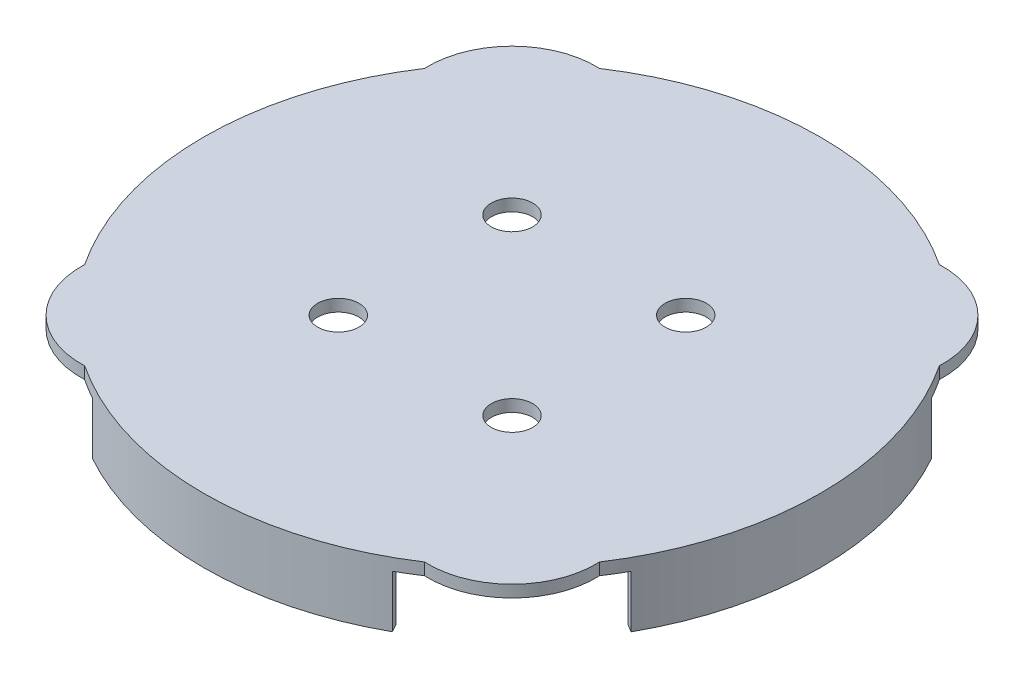
ISO-10303-21;
HEADER;
FILE_DESCRIPTION(('STEP AP214'),'2;1');
FILE_NAME('part.step','',(''),(''),'','','');
FILE_SCHEMA(('AUTOMOTIVE_DESIGN { 1 0 10303 214 1 1 1 1 }'));
ENDSEC;
DATA;
#1=APPLICATION_CONTEXT('core data for automotive mechanical design processes');
#2=APPLICATION_PROTOCOL_DEFINITION('international standard','automotive_design',2000,#1);
#3=PRODUCT_CONTEXT('',#1,'mechanical');
#4=PRODUCT('Part','Part','',(#3));
#5=PRODUCT_RELATED_PRODUCT_CATEGORY('part','',(#4));
#6=PRODUCT_DEFINITION_FORMATION('','',#4);
#7=PRODUCT_DEFINITION_CONTEXT('part definition',#1,'design');
#8=PRODUCT_DEFINITION('design','',#6,#7);
#9=PRODUCT_DEFINITION_SHAPE('','',#8);
#10=(LENGTH_UNIT() NAMED_UNIT(*) SI_UNIT(.MILLI.,.METRE.));
#11=(NAMED_UNIT(*) PLANE_ANGLE_UNIT() SI_UNIT($,.RADIAN.));
#12=(NAMED_UNIT(*) SI_UNIT($,.STERADIAN.) SOLID_ANGLE_UNIT());
#13=UNCERTAINTY_MEASURE_WITH_UNIT(LENGTH_MEASURE(1.E-05),#10,'distance_accuracy_value','');
#14=(GEOMETRIC_REPRESENTATION_CONTEXT(3) GLOBAL_UNCERTAINTY_ASSIGNED_CONTEXT((#13)) GLOBAL_UNIT_ASSIGNED_CONTEXT((#10,
#11,#12)) REPRESENTATION_CONTEXT('',''));
#15=CARTESIAN_POINT('',(0.,0.,0.));
#16=DIRECTION('',(0.,0.,1.));
#17=DIRECTION('',(1.,0.,0.));
#18=AXIS2_PLACEMENT_3D('',#15,#16,#17);
#19=CARTESIAN_POINT('',(14.5,0.,-14.5));
#20=DIRECTION('',(0.,1.,0.));
#21=DIRECTION('',(0.,0.,1.));
#22=AXIS2_PLACEMENT_3D('',#19,#20,#21);
#23=PLANE('',#22);
#24=CARTESIAN_POINT('',(14.5,0.,-14.5));
#25=DIRECTION('',(0.,1.,0.));
#26=DIRECTION('',(0.,0.,1.));
#27=AXIS2_PLACEMENT_3D('',#24,#25,#26);
#28=CIRCLE('',#27,3.45);
#29=CARTESIAN_POINT('',(14.5,0.,-11.05));
#30=VERTEX_POINT('',#29);
#31=EDGE_CURVE('E369',#30,#30,#28,.T.);
#32=ORIENTED_EDGE('',*,*,#31,.T.);
#33=EDGE_LOOP('',(#32));
#34=FACE_BOUND('',#33,.T.);
#35=CARTESIAN_POINT('',(-14.5,0.,-14.4999999999998));
#36=DIRECTION('',(0.,1.,0.));
#37=DIRECTION('',(0.,0.,1.));
#38=AXIS2_PLACEMENT_3D('',#35,#36,#37);
#39=CIRCLE('',#38,3.45);
#40=CARTESIAN_POINT('',(-14.5,0.,-11.0499999999998));
#41=VERTEX_POINT('',#40);
#42=EDGE_CURVE('E361',#41,#41,#39,.T.);
#43=ORIENTED_EDGE('',*,*,#42,.T.);
#44=EDGE_LOOP('',(#43));
#45=FACE_BOUND('',#44,.T.);
#46=CARTESIAN_POINT('',(-14.4999999999997,0.,14.5000000000002));
#47=DIRECTION('',(0.,1.,0.));
#48=DIRECTION('',(0.,0.,1.));
#49=AXIS2_PLACEMENT_3D('',#46,#47,#48);
#50=CIRCLE('',#49,3.45);
#51=CARTESIAN_POINT('',(-14.4999999999997,0.,17.9500000000002));
#52=VERTEX_POINT('',#51);
#53=EDGE_CURVE('E353',#52,#52,#50,.T.);
#54=ORIENTED_EDGE('',*,*,#53,.T.);
#55=EDGE_LOOP('',(#54));
#56=FACE_BOUND('',#55,.T.);
#57=CARTESIAN_POINT('',(14.5000000000003,0.,14.5));
#58=DIRECTION('',(0.,1.,0.));
#59=DIRECTION('',(0.,0.,1.));
#60=AXIS2_PLACEMENT_3D('',#57,#58,#59);
#61=CIRCLE('',#60,3.45);
#62=CARTESIAN_POINT('',(14.5000000000003,0.,17.95));
#63=VERTEX_POINT('',#62);
#64=EDGE_CURVE('E348',#63,#63,#61,.T.);
#65=ORIENTED_EDGE('',*,*,#64,.T.);
#66=EDGE_LOOP('',(#65));
#67=FACE_BOUND('',#66,.T.);
#68=DIRECTION('',(0.486274592443671,0.,0.873806054421541));
#69=VECTOR('',#68,1.);
#70=CARTESIAN_POINT('',(24.3137296222045,0.,43.6903027210654));
#71=LINE('',#70,#69);
#72=CARTESIAN_POINT('',(24.3137296222045,0.,43.6903027210654));
#73=VERTEX_POINT('',#72);
#74=CARTESIAN_POINT('',(25.04314151087,0.,45.0010118026977));
#75=VERTEX_POINT('',#74);
#76=EDGE_CURVE('E548',#73,#75,#71,.T.);
#77=ORIENTED_EDGE('',*,*,#76,.F.);
#78=CARTESIAN_POINT('',(0.,0.,-6.03683769639929E-13));
#79=DIRECTION('',(0.,1.,0.));
#80=DIRECTION('',(1.,0.,0.));
#81=AXIS2_PLACEMENT_3D('',#78,#79,#80);
#82=CIRCLE('',#81,50.0000000000008);
#83=CARTESIAN_POINT('',(-24.3137296222674,0.,43.690302721031));
#84=VERTEX_POINT('',#83);
#85=EDGE_CURVE('E226',#84,#73,#82,.T.);
#86=ORIENTED_EDGE('',*,*,#85,.F.);
#87=DIRECTION('',(0.519693841497621,0.,-0.85435256838699));
#88=VECTOR('',#87,1.);
#89=CARTESIAN_POINT('',(-25.0938366318168,0.,44.9727624579111));
#90=LINE('',#89,#88);
#91=CARTESIAN_POINT('',(-25.0938366318168,0.,44.9727624579111));
#92=VERTEX_POINT('',#91);
#93=EDGE_CURVE('E222',#92,#84,#90,.T.);
#94=ORIENTED_EDGE('',*,*,#93,.F.);
#95=CARTESIAN_POINT('',(0.,0.,0.));
#96=DIRECTION('',(0.,1.,0.));
#97=DIRECTION('',(0.,0.,1.));
#98=AXIS2_PLACEMENT_3D('',#95,#96,#97);
#99=CIRCLE('',#98,51.5);
#100=CARTESIAN_POINT('',(-28.363609444048,0.,42.9855284869863));
#101=VERTEX_POINT('',#100);
#102=EDGE_CURVE('E432',#101,#92,#99,.T.);
#103=ORIENTED_EDGE('',*,*,#102,.F.);
#104=CARTESIAN_POINT('',(-29.,0.,29.0000000000004));
#105=DIRECTION('',(0.,1.,0.));
#106=DIRECTION('',(0.,0.,1.));
#107=AXIS2_PLACEMENT_3D('',#104,#105,#106);
#108=CIRCLE('',#107,14.);
#109=CARTESIAN_POINT('',(-42.9855284869859,0.,28.3636094440485));
#110=VERTEX_POINT('',#109);
#111=EDGE_CURVE('E428',#110,#101,#108,.T.);
#112=ORIENTED_EDGE('',*,*,#111,.F.);
#113=CARTESIAN_POINT('',(0.,0.,0.));
#114=DIRECTION('',(0.,1.,0.));
#115=DIRECTION('',(0.,0.,1.));
#116=AXIS2_PLACEMENT_3D('',#113,#114,#115);
#117=CIRCLE('',#116,51.5);
#118=CARTESIAN_POINT('',(-45.001011802698,0.,25.0431415108695));
#119=VERTEX_POINT('',#118);
#120=EDGE_CURVE('E423',#119,#110,#117,.T.);
#121=ORIENTED_EDGE('',*,*,#120,.F.);
#122=DIRECTION('',(-0.873806054421546,0.,0.486274592443662));
#123=VECTOR('',#122,1.);
#124=CARTESIAN_POINT('',(-43.6903027210657,0.,24.313729622204));
#125=LINE('',#124,#123);
#126=CARTESIAN_POINT('',(-43.6903027210657,0.,24.313729622204));
#127=VERTEX_POINT('',#126);
#128=EDGE_CURVE('E234',#127,#119,#125,.T.);
#129=ORIENTED_EDGE('',*,*,#128,.F.);
#130=CARTESIAN_POINT('',(6.03683769639929E-13,0.,0.));
#131=DIRECTION('',(0.,1.,0.));
#132=DIRECTION('',(0.,0.,1.));
#133=AXIS2_PLACEMENT_3D('',#130,#131,#132);
#134=CIRCLE('',#133,50.0000000000008);
#135=CARTESIAN_POINT('',(-43.6903027210307,0.,-24.3137296222678));
#136=VERTEX_POINT('',#135);
#137=EDGE_CURVE('E229',#136,#127,#134,.T.);
#138=ORIENTED_EDGE('',*,*,#137,.F.);
#139=DIRECTION('',(0.854352568386984,0.,0.51969384149763));
#140=VECTOR('',#139,1.);
#141=CARTESIAN_POINT('',(-44.9727624579108,0.,-25.0938366318172));
#142=LINE('',#141,#140);
#143=CARTESIAN_POINT('',(-44.9727624579108,0.,-25.0938366318172));
#144=VERTEX_POINT('',#143);
#145=EDGE_CURVE('E245',#144,#136,#142,.T.);
#146=ORIENTED_EDGE('',*,*,#145,.F.);
#147=CARTESIAN_POINT('',(-42.9855284869861,0.,-28.3636094440484));
#148=VERTEX_POINT('',#147);
#149=EDGE_CURVE('E424',#148,#144,#117,.T.);
#150=ORIENTED_EDGE('',*,*,#149,.F.);
#151=CARTESIAN_POINT('',(-29.0000000000001,0.,-29.));
#152=DIRECTION('',(0.,1.,0.));
#153=DIRECTION('',(0.,0.,1.));
#154=AXIS2_PLACEMENT_3D('',#151,#152,#153);
#155=CIRCLE('',#154,14.);
#156=CARTESIAN_POINT('',(-28.3636094440485,0.,-42.985528486986));
#157=VERTEX_POINT('',#156);
#158=EDGE_CURVE('E420',#157,#148,#155,.T.);
#159=ORIENTED_EDGE('',*,*,#158,.F.);
#160=CARTESIAN_POINT('',(0.,0.,0.));
#161=DIRECTION('',(0.,1.,0.));
#162=DIRECTION('',(0.,0.,1.));
#163=AXIS2_PLACEMENT_3D('',#160,#161,#162);
#164=CIRCLE('',#163,51.5);
#165=CARTESIAN_POINT('',(-25.0431415108697,0.,-45.0010118026979));
#166=VERTEX_POINT('',#165);
#167=EDGE_CURVE('E415',#166,#157,#164,.T.);
#168=ORIENTED_EDGE('',*,*,#167,.F.);
#169=DIRECTION('',(-0.486274592443665,0.,-0.873806054421545));
#170=VECTOR('',#169,1.);
#171=CARTESIAN_POINT('',(-24.3137296222042,0.,-43.6903027210656));
#172=LINE('',#171,#170);
#173=CARTESIAN_POINT('',(-24.3137296222042,0.,-43.6903027210656));
#174=VERTEX_POINT('',#173);
#175=EDGE_CURVE('E289',#174,#166,#172,.T.);
#176=ORIENTED_EDGE('',*,*,#175,.F.);
#177=CARTESIAN_POINT('',(0.,0.,6.03683769639929E-13));
#178=DIRECTION('',(0.,1.,0.));
#179=DIRECTION('',(-1.,0.,0.));
#180=AXIS2_PLACEMENT_3D('',#177,#178,#179);
#181=CIRCLE('',#180,50.0000000000008);
#182=CARTESIAN_POINT('',(24.3137296222677,0.,-43.6903027210308));
#183=VERTEX_POINT('',#182);
#184=EDGE_CURVE('E270',#183,#174,#181,.T.);
#185=ORIENTED_EDGE('',*,*,#184,.F.);
#186=DIRECTION('',(-0.519693841497627,0.,0.854352568386986));
#187=VECTOR('',#186,1.);
#188=CARTESIAN_POINT('',(25.0938366318171,0.,-44.9727624579109));
#189=LINE('',#188,#187);
#190=CARTESIAN_POINT('',(25.0938366318171,0.,-44.9727624579109));
#191=VERTEX_POINT('',#190);
#192=EDGE_CURVE('E276',#191,#183,#189,.T.);
#193=ORIENTED_EDGE('',*,*,#192,.F.);
#194=CARTESIAN_POINT('',(28.3636094440485,0.,-42.985528486986));
#195=VERTEX_POINT('',#194);
#196=EDGE_CURVE('E416',#195,#191,#164,.T.);
#197=ORIENTED_EDGE('',*,*,#196,.F.);
#198=CARTESIAN_POINT('',(28.9999999999999,0.,-29.));
#199=DIRECTION('',(0.,1.,0.));
#200=DIRECTION('',(0.,0.,1.));
#201=AXIS2_PLACEMENT_3D('',#198,#199,#200);
#202=CIRCLE('',#201,14.);
#203=CARTESIAN_POINT('',(42.9855284869859,0.,-28.3636094440486));
#204=VERTEX_POINT('',#203);
#205=EDGE_CURVE('E412',#204,#195,#202,.T.);
#206=ORIENTED_EDGE('',*,*,#205,.F.);
#207=CARTESIAN_POINT('',(0.,0.,0.));
#208=DIRECTION('',(0.,1.,0.));
#209=DIRECTION('',(0.,0.,1.));
#210=AXIS2_PLACEMENT_3D('',#207,#208,#209);
#211=CIRCLE('',#210,51.5);
#212=CARTESIAN_POINT('',(45.001011802698,0.,-25.0431415108695));
#213=VERTEX_POINT('',#212);
#214=EDGE_CURVE('E377',#213,#204,#211,.T.);
#215=ORIENTED_EDGE('',*,*,#214,.F.);
#216=DIRECTION('',(0.873806054421546,0.,-0.486274592443662));
#217=VECTOR('',#216,1.);
#218=CARTESIAN_POINT('',(43.6903027210657,0.,-24.313729622204));
#219=LINE('',#218,#217);
#220=CARTESIAN_POINT('',(43.6903027210657,0.,-24.313729622204));
#221=VERTEX_POINT('',#220);
#222=EDGE_CURVE('E326',#221,#213,#219,.T.);
#223=ORIENTED_EDGE('',*,*,#222,.F.);
#224=CARTESIAN_POINT('',(-6.03683769639929E-13,0.,0.));
#225=DIRECTION('',(0.,1.,0.));
#226=DIRECTION('',(0.,0.,-1.));
#227=AXIS2_PLACEMENT_3D('',#224,#225,#226);
#228=CIRCLE('',#227,50.0000000000008);
#229=CARTESIAN_POINT('',(43.6903027210307,0.,24.3137296222678));
#230=VERTEX_POINT('',#229);
#231=EDGE_CURVE('E307',#230,#221,#228,.T.);
#232=ORIENTED_EDGE('',*,*,#231,.F.);
#233=DIRECTION('',(-0.854352568386984,0.,-0.51969384149763));
#234=VECTOR('',#233,1.);
#235=CARTESIAN_POINT('',(44.9727624579108,0.,25.0938366318172));
#236=LINE('',#235,#234);
#237=CARTESIAN_POINT('',(44.9727624579108,0.,25.0938366318172));
#238=VERTEX_POINT('',#237);
#239=EDGE_CURVE('E313',#238,#230,#236,.T.);
#240=ORIENTED_EDGE('',*,*,#239,.F.);
#241=CARTESIAN_POINT('',(42.9855284869862,0.,28.3636094440484));
#242=VERTEX_POINT('',#241);
#243=EDGE_CURVE('E408',#242,#238,#211,.T.);
#244=ORIENTED_EDGE('',*,*,#243,.F.);
#245=CARTESIAN_POINT('',(29.,0.,28.9999999999996));
#246=DIRECTION('',(0.,1.,0.));
#247=DIRECTION('',(0.,0.,1.));
#248=AXIS2_PLACEMENT_3D('',#245,#246,#247);
#249=CIRCLE('',#248,14.0000000000002);
#250=CARTESIAN_POINT('',(28.3636094440486,0.,42.9855284869858));
#251=VERTEX_POINT('',#250);
#252=EDGE_CURVE('E386',#251,#242,#249,.T.);
#253=ORIENTED_EDGE('',*,*,#252,.F.);
#254=EDGE_CURVE('E431',#75,#251,#99,.T.);
#255=ORIENTED_EDGE('',*,*,#254,.F.);
#256=EDGE_LOOP('',(#77,#86,#94,#103,#112,#121,#129,#138,#146,#150,#159,#168,#176,#185,#193,#197,
#206,#215,#223,#232,#240,#244,#253,#255));
#257=FACE_BOUND('',#256,.T.);
#258=ADVANCED_FACE('F41',(#34,#45,#56,#67,#257),#23,.F.);
#259=CARTESIAN_POINT('',(14.5,2.,-14.5));
#260=DIRECTION('',(0.,1.,0.));
#261=DIRECTION('',(0.,0.,1.));
#262=AXIS2_PLACEMENT_3D('',#259,#260,#261);
#263=PLANE('',#262);
#264=CARTESIAN_POINT('',(-14.4999999999997,2.,14.5000000000002));
#265=DIRECTION('',(0.,1.,0.));
#266=DIRECTION('',(0.,0.,1.));
#267=AXIS2_PLACEMENT_3D('',#264,#265,#266);
#268=CIRCLE('',#267,3.45);
#269=CARTESIAN_POINT('',(-14.4999999999997,2.,17.9500000000002));
#270=VERTEX_POINT('',#269);
#271=EDGE_CURVE('E357',#270,#270,#268,.T.);
#272=ORIENTED_EDGE('',*,*,#271,.F.);
#273=EDGE_LOOP('',(#272));
#274=FACE_BOUND('',#273,.T.);
#275=CARTESIAN_POINT('',(14.5,2.,-14.5));
#276=DIRECTION('',(0.,1.,0.));
#277=DIRECTION('',(0.,0.,1.));
#278=AXIS2_PLACEMENT_3D('',#275,#276,#277);
#279=CIRCLE('',#278,3.45);
#280=CARTESIAN_POINT('',(14.5,2.,-11.05));
#281=VERTEX_POINT('',#280);
#282=EDGE_CURVE('E373',#281,#281,#279,.T.);
#283=ORIENTED_EDGE('',*,*,#282,.F.);
#284=EDGE_LOOP('',(#283));
#285=FACE_BOUND('',#284,.T.);
#286=CARTESIAN_POINT('',(0.,2.,0.));
#287=DIRECTION('',(0.,1.,0.));
#288=DIRECTION('',(0.,0.,1.));
#289=AXIS2_PLACEMENT_3D('',#286,#287,#288);
#290=CIRCLE('',#289,51.5);
#291=CARTESIAN_POINT('',(42.9855284869862,2.,28.3636094440484));
#292=VERTEX_POINT('',#291);
#293=CARTESIAN_POINT('',(42.9855284869859,2.,-28.3636094440486));
#294=VERTEX_POINT('',#293);
#295=EDGE_CURVE('E381',#292,#294,#290,.T.);
#296=ORIENTED_EDGE('',*,*,#295,.T.);
#297=CARTESIAN_POINT('',(28.9999999999999,2.,-29.));
#298=DIRECTION('',(0.,1.,0.));
#299=DIRECTION('',(0.,0.,1.));
#300=AXIS2_PLACEMENT_3D('',#297,#298,#299);
#301=CIRCLE('',#300,14.);
#302=CARTESIAN_POINT('',(28.3636094440485,2.,-42.985528486986));
#303=VERTEX_POINT('',#302);
#304=EDGE_CURVE('E385',#294,#303,#301,.T.);
#305=ORIENTED_EDGE('',*,*,#304,.T.);
#306=CARTESIAN_POINT('',(0.,2.,0.));
#307=DIRECTION('',(0.,1.,0.));
#308=DIRECTION('',(0.,0.,1.));
#309=AXIS2_PLACEMENT_3D('',#306,#307,#308);
#310=CIRCLE('',#309,51.5);
#311=CARTESIAN_POINT('',(-28.3636094440485,2.,-42.985528486986));
#312=VERTEX_POINT('',#311);
#313=EDGE_CURVE('E389',#303,#312,#310,.T.);
#314=ORIENTED_EDGE('',*,*,#313,.T.);
#315=CARTESIAN_POINT('',(-29.0000000000001,2.,-29.));
#316=DIRECTION('',(0.,1.,0.));
#317=DIRECTION('',(0.,0.,1.));
#318=AXIS2_PLACEMENT_3D('',#315,#316,#317);
#319=CIRCLE('',#318,14.);
#320=CARTESIAN_POINT('',(-42.9855284869861,2.,-28.3636094440484));
#321=VERTEX_POINT('',#320);
#322=EDGE_CURVE('E392',#312,#321,#319,.T.);
#323=ORIENTED_EDGE('',*,*,#322,.T.);
#324=CARTESIAN_POINT('',(0.,2.,0.));
#325=DIRECTION('',(0.,1.,0.));
#326=DIRECTION('',(0.,0.,1.));
#327=AXIS2_PLACEMENT_3D('',#324,#325,#326);
#328=CIRCLE('',#327,51.5);
#329=CARTESIAN_POINT('',(-42.9855284869859,2.,28.3636094440485));
#330=VERTEX_POINT('',#329);
#331=EDGE_CURVE('E395',#321,#330,#328,.T.);
#332=ORIENTED_EDGE('',*,*,#331,.T.);
#333=CARTESIAN_POINT('',(-29.,2.,29.0000000000004));
#334=DIRECTION('',(0.,1.,0.));
#335=DIRECTION('',(0.,0.,1.));
#336=AXIS2_PLACEMENT_3D('',#333,#334,#335);
#337=CIRCLE('',#336,14.);
#338=CARTESIAN_POINT('',(-28.363609444048,2.,42.9855284869863));
#339=VERTEX_POINT('',#338);
#340=EDGE_CURVE('E398',#330,#339,#337,.T.);
#341=ORIENTED_EDGE('',*,*,#340,.T.);
#342=CARTESIAN_POINT('',(0.,2.,0.));
#343=DIRECTION('',(0.,1.,0.));
#344=DIRECTION('',(0.,0.,1.));
#345=AXIS2_PLACEMENT_3D('',#342,#343,#344);
#346=CIRCLE('',#345,51.5);
#347=CARTESIAN_POINT('',(28.3636094440486,2.,42.9855284869858));
#348=VERTEX_POINT('',#347);
#349=EDGE_CURVE('E401',#339,#348,#346,.T.);
#350=ORIENTED_EDGE('',*,*,#349,.T.);
#351=CARTESIAN_POINT('',(29.,2.,28.9999999999996));
#352=DIRECTION('',(0.,1.,0.));
#353=DIRECTION('',(0.,0.,1.));
#354=AXIS2_PLACEMENT_3D('',#351,#352,#353);
#355=CIRCLE('',#354,14.0000000000002);
#356=EDGE_CURVE('E404',#348,#292,#355,.T.);
#357=ORIENTED_EDGE('',*,*,#356,.T.);
#358=EDGE_LOOP('',(#296,#305,#314,#323,#332,#341,#350,#357));
#359=FACE_BOUND('',#358,.T.);
#360=CARTESIAN_POINT('',(-14.5,2.,-14.4999999999998));
#361=DIRECTION('',(0.,1.,0.));
#362=DIRECTION('',(0.,0.,1.));
#363=AXIS2_PLACEMENT_3D('',#360,#361,#362);
#364=CIRCLE('',#363,3.45);
#365=CARTESIAN_POINT('',(-14.5,2.,-11.0499999999998));
#366=VERTEX_POINT('',#365);
#367=EDGE_CURVE('E365',#366,#366,#364,.T.);
#368=ORIENTED_EDGE('',*,*,#367,.F.);
#369=EDGE_LOOP('',(#368));
#370=FACE_BOUND('',#369,.T.);
#371=CARTESIAN_POINT('',(14.5000000000003,2.,14.5));
#372=DIRECTION('',(0.,1.,0.));
#373=DIRECTION('',(0.,0.,1.));
#374=AXIS2_PLACEMENT_3D('',#371,#372,#373);
#375=CIRCLE('',#374,3.45);
#376=CARTESIAN_POINT('',(14.5000000000003,2.,17.95));
#377=VERTEX_POINT('',#376);
#378=EDGE_CURVE('E349',#377,#377,#375,.T.);
#379=ORIENTED_EDGE('',*,*,#378,.F.);
#380=EDGE_LOOP('',(#379));
#381=FACE_BOUND('',#380,.T.);
#382=ADVANCED_FACE('F561',(#274,#285,#359,#370,#381),#263,.T.);
#383=CARTESIAN_POINT('',(0.,2.,0.));
#384=DIRECTION('',(0.,-1.,0.));
#385=DIRECTION('',(0.,0.,-1.));
#386=AXIS2_PLACEMENT_3D('',#383,#384,#385);
#387=CYLINDRICAL_SURFACE('',#386,51.5);
#388=ORIENTED_EDGE('',*,*,#243,.T.);
#389=DIRECTION('',(0.,1.,0.));
#390=VECTOR('',#389,1.);
#391=CARTESIAN_POINT('',(44.9727624579108,-8.75,25.0938366318172));
#392=LINE('',#391,#390);
#393=CARTESIAN_POINT('',(44.9727624579108,-8.75,25.0938366318172));
#394=VERTEX_POINT('',#393);
#395=EDGE_CURVE('E336',#394,#238,#392,.T.);
#396=ORIENTED_EDGE('',*,*,#395,.F.);
#397=CARTESIAN_POINT('',(-6.03683769639929E-13,-8.75,0.));
#398=DIRECTION('',(0.,-1.,0.));
#399=DIRECTION('',(0.,0.,-1.));
#400=AXIS2_PLACEMENT_3D('',#397,#398,#399);
#401=CIRCLE('',#400,51.5000000000006);
#402=CARTESIAN_POINT('',(45.001011802698,-8.75,-25.0431415108695));
#403=VERTEX_POINT('',#402);
#404=EDGE_CURVE('E316',#403,#394,#401,.T.);
#405=ORIENTED_EDGE('',*,*,#404,.F.);
#406=DIRECTION('',(0.,1.,0.));
#407=VECTOR('',#406,1.);
#408=CARTESIAN_POINT('',(45.001011802698,-8.75,-25.0431415108695));
#409=LINE('',#408,#407);
#410=EDGE_CURVE('E340',#403,#213,#409,.T.);
#411=ORIENTED_EDGE('',*,*,#410,.T.);
#412=ORIENTED_EDGE('',*,*,#214,.T.);
#413=DIRECTION('',(0.,-1.,0.));
#414=VECTOR('',#413,1.);
#415=CARTESIAN_POINT('',(42.9855284869859,2.,-28.3636094440486));
#416=LINE('',#415,#414);
#417=EDGE_CURVE('E11',#294,#204,#416,.T.);
#418=ORIENTED_EDGE('',*,*,#417,.F.);
#419=ORIENTED_EDGE('',*,*,#295,.F.);
#420=DIRECTION('',(0.,-1.,0.));
#421=VECTOR('',#420,1.);
#422=CARTESIAN_POINT('',(42.9855284869862,2.,28.3636094440484));
#423=LINE('',#422,#421);
#424=EDGE_CURVE('E407',#292,#242,#423,.T.);
#425=ORIENTED_EDGE('',*,*,#424,.T.);
#426=EDGE_LOOP('',(#388,#396,#405,#411,#412,#418,#419,#425));
#427=FACE_BOUND('',#426,.T.);
#428=ADVANCED_FACE('F43',(#427),#387,.T.);
#429=CARTESIAN_POINT('',(28.9999999999999,2.,-29.));
#430=DIRECTION('',(0.,-1.,0.));
#431=DIRECTION('',(0.,0.,-1.));
#432=AXIS2_PLACEMENT_3D('',#429,#430,#431);
#433=CYLINDRICAL_SURFACE('',#432,14.);
#434=ORIENTED_EDGE('',*,*,#205,.T.);
#435=DIRECTION('',(0.,-1.,0.));
#436=VECTOR('',#435,1.);
#437=CARTESIAN_POINT('',(28.3636094440485,2.,-42.985528486986));
#438=LINE('',#437,#436);
#439=EDGE_CURVE('E50',#303,#195,#438,.T.);
#440=ORIENTED_EDGE('',*,*,#439,.F.);
#441=ORIENTED_EDGE('',*,*,#304,.F.);
#442=ORIENTED_EDGE('',*,*,#417,.T.);
#443=EDGE_LOOP('',(#434,#440,#441,#442));
#444=FACE_BOUND('',#443,.T.);
#445=ADVANCED_FACE('F586',(#444),#433,.T.);
#446=CARTESIAN_POINT('',(0.,2.,0.));
#447=DIRECTION('',(0.,-1.,0.));
#448=DIRECTION('',(0.,0.,-1.));
#449=AXIS2_PLACEMENT_3D('',#446,#447,#448);
#450=CYLINDRICAL_SURFACE('',#449,51.5);
#451=ORIENTED_EDGE('',*,*,#196,.T.);
#452=DIRECTION('',(0.,1.,0.));
#453=VECTOR('',#452,1.);
#454=CARTESIAN_POINT('',(25.0938366318171,-8.75,-44.9727624579109));
#455=LINE('',#454,#453);
#456=CARTESIAN_POINT('',(25.0938366318171,-8.75,-44.9727624579109));
#457=VERTEX_POINT('',#456);
#458=EDGE_CURVE('E298',#457,#191,#455,.T.);
#459=ORIENTED_EDGE('',*,*,#458,.F.);
#460=CARTESIAN_POINT('',(0.,-8.75,6.03683769639929E-13));
#461=DIRECTION('',(0.,-1.,0.));
#462=DIRECTION('',(-1.,0.,0.));
#463=AXIS2_PLACEMENT_3D('',#460,#461,#462);
#464=CIRCLE('',#463,51.5000000000006);
#465=CARTESIAN_POINT('',(-25.0431415108697,-8.75,-45.0010118026979));
#466=VERTEX_POINT('',#465);
#467=EDGE_CURVE('E279',#466,#457,#464,.T.);
#468=ORIENTED_EDGE('',*,*,#467,.F.);
#469=DIRECTION('',(0.,1.,0.));
#470=VECTOR('',#469,1.);
#471=CARTESIAN_POINT('',(-25.0431415108697,-8.75,-45.0010118026979));
#472=LINE('',#471,#470);
#473=EDGE_CURVE('E301',#466,#166,#472,.T.);
#474=ORIENTED_EDGE('',*,*,#473,.T.);
#475=ORIENTED_EDGE('',*,*,#167,.T.);
#476=DIRECTION('',(0.,-1.,0.));
#477=VECTOR('',#476,1.);
#478=CARTESIAN_POINT('',(-28.3636094440485,2.,-42.985528486986));
#479=LINE('',#478,#477);
#480=EDGE_CURVE('E457',#312,#157,#479,.T.);
#481=ORIENTED_EDGE('',*,*,#480,.F.);
#482=ORIENTED_EDGE('',*,*,#313,.F.);
#483=ORIENTED_EDGE('',*,*,#439,.T.);
#484=EDGE_LOOP('',(#451,#459,#468,#474,#475,#481,#482,#483));
#485=FACE_BOUND('',#484,.T.);
#486=ADVANCED_FACE('F466',(#485),#450,.T.);
#487=CARTESIAN_POINT('',(-29.0000000000001,2.,-29.));
#488=DIRECTION('',(0.,-1.,0.));
#489=DIRECTION('',(0.,0.,-1.));
#490=AXIS2_PLACEMENT_3D('',#487,#488,#489);
#491=CYLINDRICAL_SURFACE('',#490,14.);
#492=ORIENTED_EDGE('',*,*,#158,.T.);
#493=DIRECTION('',(0.,-1.,0.));
#494=VECTOR('',#493,1.);
#495=CARTESIAN_POINT('',(-42.9855284869861,2.,-28.3636094440484));
#496=LINE('',#495,#494);
#497=EDGE_CURVE('E453',#321,#148,#496,.T.);
#498=ORIENTED_EDGE('',*,*,#497,.F.);
#499=ORIENTED_EDGE('',*,*,#322,.F.);
#500=ORIENTED_EDGE('',*,*,#480,.T.);
#501=EDGE_LOOP('',(#492,#498,#499,#500));
#502=FACE_BOUND('',#501,.T.);
#503=ADVANCED_FACE('F581',(#502),#491,.T.);
#504=CARTESIAN_POINT('',(0.,2.,0.));
#505=DIRECTION('',(0.,-1.,0.));
#506=DIRECTION('',(0.,0.,-1.));
#507=AXIS2_PLACEMENT_3D('',#504,#505,#506);
#508=CYLINDRICAL_SURFACE('',#507,51.5);
#509=ORIENTED_EDGE('',*,*,#149,.T.);
#510=DIRECTION('',(0.,1.,0.));
#511=VECTOR('',#510,1.);
#512=CARTESIAN_POINT('',(-44.9727624579108,-8.75,-25.0938366318172));
#513=LINE('',#512,#511);
#514=CARTESIAN_POINT('',(-44.9727624579108,-8.75,-25.0938366318172));
#515=VERTEX_POINT('',#514);
#516=EDGE_CURVE('E262',#515,#144,#513,.T.);
#517=ORIENTED_EDGE('',*,*,#516,.F.);
#518=CARTESIAN_POINT('',(6.03683769639929E-13,-8.75,0.));
#519=DIRECTION('',(0.,-1.,0.));
#520=DIRECTION('',(0.,0.,1.));
#521=AXIS2_PLACEMENT_3D('',#518,#519,#520);
#522=CIRCLE('',#521,51.5000000000006);
#523=CARTESIAN_POINT('',(-45.001011802698,-8.75,25.0431415108695));
#524=VERTEX_POINT('',#523);
#525=EDGE_CURVE('E248',#524,#515,#522,.T.);
#526=ORIENTED_EDGE('',*,*,#525,.F.);
#527=DIRECTION('',(0.,1.,0.));
#528=VECTOR('',#527,1.);
#529=CARTESIAN_POINT('',(-45.001011802698,-8.75,25.0431415108695));
#530=LINE('',#529,#528);
#531=EDGE_CURVE('E65',#524,#119,#530,.T.);
#532=ORIENTED_EDGE('',*,*,#531,.T.);
#533=ORIENTED_EDGE('',*,*,#120,.T.);
#534=DIRECTION('',(0.,-1.,0.));
#535=VECTOR('',#534,1.);
#536=CARTESIAN_POINT('',(-42.9855284869859,2.,28.3636094440485));
#537=LINE('',#536,#535);
#538=EDGE_CURVE('E449',#330,#110,#537,.T.);
#539=ORIENTED_EDGE('',*,*,#538,.F.);
#540=ORIENTED_EDGE('',*,*,#331,.F.);
#541=ORIENTED_EDGE('',*,*,#497,.T.);
#542=EDGE_LOOP('',(#509,#517,#526,#532,#533,#539,#540,#541));
#543=FACE_BOUND('',#542,.T.);
#544=ADVANCED_FACE('F524',(#543),#508,.T.);
#545=CARTESIAN_POINT('',(-29.,2.,29.0000000000004));
#546=DIRECTION('',(0.,-1.,0.));
#547=DIRECTION('',(0.,0.,-1.));
#548=AXIS2_PLACEMENT_3D('',#545,#546,#547);
#549=CYLINDRICAL_SURFACE('',#548,14.);
#550=ORIENTED_EDGE('',*,*,#111,.T.);
#551=DIRECTION('',(0.,-1.,0.));
#552=VECTOR('',#551,1.);
#553=CARTESIAN_POINT('',(-28.363609444048,2.,42.9855284869863));
#554=LINE('',#553,#552);
#555=EDGE_CURVE('E445',#339,#101,#554,.T.);
#556=ORIENTED_EDGE('',*,*,#555,.F.);
#557=ORIENTED_EDGE('',*,*,#340,.F.);
#558=ORIENTED_EDGE('',*,*,#538,.T.);
#559=EDGE_LOOP('',(#550,#556,#557,#558));
#560=FACE_BOUND('',#559,.T.);
#561=ADVANCED_FACE('F530',(#560),#549,.T.);
#562=CARTESIAN_POINT('',(0.,2.,0.));
#563=DIRECTION('',(0.,-1.,0.));
#564=DIRECTION('',(0.,0.,-1.));
#565=AXIS2_PLACEMENT_3D('',#562,#563,#564);
#566=CYLINDRICAL_SURFACE('',#565,51.5);
#567=ORIENTED_EDGE('',*,*,#102,.T.);
#568=DIRECTION('',(0.,1.,0.));
#569=VECTOR('',#568,1.);
#570=CARTESIAN_POINT('',(-25.0938366318168,-8.75,44.9727624579111));
#571=LINE('',#570,#569);
#572=CARTESIAN_POINT('',(-25.0938366318168,-8.75,44.9727624579111));
#573=VERTEX_POINT('',#572);
#574=EDGE_CURVE('E236',#573,#92,#571,.T.);
#575=ORIENTED_EDGE('',*,*,#574,.F.);
#576=CARTESIAN_POINT('',(0.,-8.75,-6.03683769639929E-13));
#577=DIRECTION('',(0.,-1.,0.));
#578=DIRECTION('',(1.,0.,0.));
#579=AXIS2_PLACEMENT_3D('',#576,#577,#578);
#580=CIRCLE('',#579,51.5000000000006);
#581=CARTESIAN_POINT('',(25.04314151087,-8.75,45.0010118026978));
#582=VERTEX_POINT('',#581);
#583=EDGE_CURVE('E211',#582,#573,#580,.T.);
#584=ORIENTED_EDGE('',*,*,#583,.F.);
#585=DIRECTION('',(0.,1.,0.));
#586=VECTOR('',#585,1.);
#587=CARTESIAN_POINT('',(25.04314151087,-8.75,45.0010118026978));
#588=LINE('',#587,#586);
#589=EDGE_CURVE('E57',#582,#75,#588,.T.);
#590=ORIENTED_EDGE('',*,*,#589,.T.);
#591=ORIENTED_EDGE('',*,*,#254,.T.);
#592=DIRECTION('',(0.,-1.,0.));
#593=VECTOR('',#592,1.);
#594=CARTESIAN_POINT('',(28.3636094440486,2.,42.9855284869858));
#595=LINE('',#594,#593);
#596=EDGE_CURVE('E441',#348,#251,#595,.T.);
#597=ORIENTED_EDGE('',*,*,#596,.F.);
#598=ORIENTED_EDGE('',*,*,#349,.F.);
#599=ORIENTED_EDGE('',*,*,#555,.T.);
#600=EDGE_LOOP('',(#567,#575,#584,#590,#591,#597,#598,#599));
#601=FACE_BOUND('',#600,.T.);
#602=ADVANCED_FACE('F519',(#601),#566,.T.);
#603=CARTESIAN_POINT('',(29.,2.,28.9999999999996));
#604=DIRECTION('',(0.,-1.,0.));
#605=DIRECTION('',(0.,0.,-1.));
#606=AXIS2_PLACEMENT_3D('',#603,#604,#605);
#607=CYLINDRICAL_SURFACE('',#606,14.0000000000002);
#608=ORIENTED_EDGE('',*,*,#252,.T.);
#609=ORIENTED_EDGE('',*,*,#424,.F.);
#610=ORIENTED_EDGE('',*,*,#356,.F.);
#611=ORIENTED_EDGE('',*,*,#596,.T.);
#612=EDGE_LOOP('',(#608,#609,#610,#611));
#613=FACE_BOUND('',#612,.T.);
#614=ADVANCED_FACE('F515',(#613),#607,.T.);
#615=CARTESIAN_POINT('',(14.5,2.,-14.5));
#616=DIRECTION('',(0.,-1.,0.));
#617=DIRECTION('',(0.,0.,-1.));
#618=AXIS2_PLACEMENT_3D('',#615,#616,#617);
#619=CYLINDRICAL_SURFACE('',#618,3.45);
#620=ORIENTED_EDGE('',*,*,#282,.T.);
#621=EDGE_LOOP('',(#620));
#622=FACE_BOUND('',#621,.T.);
#623=ORIENTED_EDGE('',*,*,#31,.F.);
#624=EDGE_LOOP('',(#623));
#625=FACE_BOUND('',#624,.T.);
#626=ADVANCED_FACE('F574',(#622,#625),#619,.F.);
#627=CARTESIAN_POINT('',(-14.5,2.,-14.4999999999998));
#628=DIRECTION('',(0.,-1.,0.));
#629=DIRECTION('',(0.,0.,-1.));
#630=AXIS2_PLACEMENT_3D('',#627,#628,#629);
#631=CYLINDRICAL_SURFACE('',#630,3.45);
#632=ORIENTED_EDGE('',*,*,#367,.T.);
#633=EDGE_LOOP('',(#632));
#634=FACE_BOUND('',#633,.T.);
#635=ORIENTED_EDGE('',*,*,#42,.F.);
#636=EDGE_LOOP('',(#635));
#637=FACE_BOUND('',#636,.T.);
#638=ADVANCED_FACE('F645',(#634,#637),#631,.F.);
#639=CARTESIAN_POINT('',(-14.4999999999997,2.,14.5000000000002));
#640=DIRECTION('',(0.,-1.,0.));
#641=DIRECTION('',(0.,0.,-1.));
#642=AXIS2_PLACEMENT_3D('',#639,#640,#641);
#643=CYLINDRICAL_SURFACE('',#642,3.45);
#644=ORIENTED_EDGE('',*,*,#271,.T.);
#645=EDGE_LOOP('',(#644));
#646=FACE_BOUND('',#645,.T.);
#647=ORIENTED_EDGE('',*,*,#53,.F.);
#648=EDGE_LOOP('',(#647));
#649=FACE_BOUND('',#648,.T.);
#650=ADVANCED_FACE('F641',(#646,#649),#643,.F.);
#651=CARTESIAN_POINT('',(14.5000000000003,2.,14.5));
#652=DIRECTION('',(0.,-1.,0.));
#653=DIRECTION('',(0.,0.,-1.));
#654=AXIS2_PLACEMENT_3D('',#651,#652,#653);
#655=CYLINDRICAL_SURFACE('',#654,3.45);
#656=ORIENTED_EDGE('',*,*,#378,.T.);
#657=EDGE_LOOP('',(#656));
#658=FACE_BOUND('',#657,.T.);
#659=ORIENTED_EDGE('',*,*,#64,.F.);
#660=EDGE_LOOP('',(#659));
#661=FACE_BOUND('',#660,.T.);
#662=ADVANCED_FACE('F638',(#658,#661),#655,.F.);
#663=CARTESIAN_POINT('',(-6.03683769639929E-13,-8.75,0.));
#664=DIRECTION('',(0.,1.,0.));
#665=DIRECTION('',(0.,0.,1.));
#666=AXIS2_PLACEMENT_3D('',#663,#664,#665);
#667=CYLINDRICAL_SURFACE('',#666,50.0000000000008);
#668=ORIENTED_EDGE('',*,*,#231,.T.);
#669=DIRECTION('',(0.,1.,0.));
#670=VECTOR('',#669,1.);
#671=CARTESIAN_POINT('',(43.6903027210657,-8.75,-24.313729622204));
#672=LINE('',#671,#670);
#673=CARTESIAN_POINT('',(43.6903027210657,-8.75,-24.313729622204));
#674=VERTEX_POINT('',#673);
#675=EDGE_CURVE('E344',#674,#221,#672,.T.);
#676=ORIENTED_EDGE('',*,*,#675,.F.);
#677=CARTESIAN_POINT('',(-6.03683769639929E-13,-8.75,0.));
#678=DIRECTION('',(0.,1.,0.));
#679=DIRECTION('',(0.,0.,-1.));
#680=AXIS2_PLACEMENT_3D('',#677,#678,#679);
#681=CIRCLE('',#680,50.0000000000008);
#682=CARTESIAN_POINT('',(43.6903027210307,-8.75,24.3137296222678));
#683=VERTEX_POINT('',#682);
#684=EDGE_CURVE('E308',#683,#674,#681,.T.);
#685=ORIENTED_EDGE('',*,*,#684,.F.);
#686=DIRECTION('',(0.,1.,0.));
#687=VECTOR('',#686,1.);
#688=CARTESIAN_POINT('',(43.6903027210307,-8.75,24.3137296222678));
#689=LINE('',#688,#687);
#690=EDGE_CURVE('E322',#683,#230,#689,.T.);
#691=ORIENTED_EDGE('',*,*,#690,.T.);
#692=EDGE_LOOP('',(#668,#676,#685,#691));
#693=FACE_BOUND('',#692,.T.);
#694=ADVANCED_FACE('F504',(#693),#667,.F.);
#695=CARTESIAN_POINT('',(43.6903027210657,-8.75,-24.313729622204));
#696=DIRECTION('',(0.486274592443662,0.,0.873806054421546));
#697=DIRECTION('',(0.873806054421546,0.,-0.486274592443662));
#698=AXIS2_PLACEMENT_3D('',#695,#696,#697);
#699=PLANE('',#698);
#700=ORIENTED_EDGE('',*,*,#222,.T.);
#701=ORIENTED_EDGE('',*,*,#410,.F.);
#702=DIRECTION('',(0.873806054421546,0.,-0.486274592443662));
#703=VECTOR('',#702,1.);
#704=CARTESIAN_POINT('',(43.6903027210657,-8.75,-24.313729622204));
#705=LINE('',#704,#703);
#706=EDGE_CURVE('E312',#674,#403,#705,.T.);
#707=ORIENTED_EDGE('',*,*,#706,.F.);
#708=ORIENTED_EDGE('',*,*,#675,.T.);
#709=EDGE_LOOP('',(#700,#701,#707,#708));
#710=FACE_BOUND('',#709,.T.);
#711=ADVANCED_FACE('F500',(#710),#699,.F.);
#712=CARTESIAN_POINT('',(44.9727624579108,-8.75,25.0938366318172));
#713=DIRECTION('',(0.519693841497629,0.,-0.854352568386984));
#714=DIRECTION('',(-0.854352568386984,0.,-0.519693841497629));
#715=AXIS2_PLACEMENT_3D('',#712,#713,#714);
#716=PLANE('',#715);
#717=ORIENTED_EDGE('',*,*,#239,.T.);
#718=ORIENTED_EDGE('',*,*,#690,.F.);
#719=DIRECTION('',(-0.854352568386984,0.,-0.51969384149763));
#720=VECTOR('',#719,1.);
#721=CARTESIAN_POINT('',(44.9727624579108,-8.75,25.0938366318172));
#722=LINE('',#721,#720);
#723=EDGE_CURVE('E319',#394,#683,#722,.T.);
#724=ORIENTED_EDGE('',*,*,#723,.F.);
#725=ORIENTED_EDGE('',*,*,#395,.T.);
#726=EDGE_LOOP('',(#717,#718,#724,#725));
#727=FACE_BOUND('',#726,.T.);
#728=ADVANCED_FACE('F508',(#727),#716,.F.);
#729=CARTESIAN_POINT('',(-6.03683769639929E-13,-8.75,0.));
#730=DIRECTION('',(0.,-1.,0.));
#731=DIRECTION('',(0.,0.,-1.));
#732=AXIS2_PLACEMENT_3D('',#729,#730,#731);
#733=PLANE('',#732);
#734=ORIENTED_EDGE('',*,*,#684,.T.);
#735=ORIENTED_EDGE('',*,*,#706,.T.);
#736=ORIENTED_EDGE('',*,*,#404,.T.);
#737=ORIENTED_EDGE('',*,*,#723,.T.);
#738=EDGE_LOOP('',(#734,#735,#736,#737));
#739=FACE_BOUND('',#738,.T.);
#740=ADVANCED_FACE('F628',(#739),#733,.T.);
#741=CARTESIAN_POINT('',(0.,-8.75,6.03683769639929E-13));
#742=DIRECTION('',(0.,1.,0.));
#743=DIRECTION('',(0.,0.,1.));
#744=AXIS2_PLACEMENT_3D('',#741,#742,#743);
#745=CYLINDRICAL_SURFACE('',#744,50.0000000000008);
#746=ORIENTED_EDGE('',*,*,#184,.T.);
#747=DIRECTION('',(0.,1.,0.));
#748=VECTOR('',#747,1.);
#749=CARTESIAN_POINT('',(-24.3137296222042,-8.75,-43.6903027210656));
#750=LINE('',#749,#748);
#751=CARTESIAN_POINT('',(-24.3137296222042,-8.75,-43.6903027210656));
#752=VERTEX_POINT('',#751);
#753=EDGE_CURVE('E304',#752,#174,#750,.T.);
#754=ORIENTED_EDGE('',*,*,#753,.F.);
#755=CARTESIAN_POINT('',(0.,-8.75,6.03683769639929E-13));
#756=DIRECTION('',(0.,1.,0.));
#757=DIRECTION('',(-1.,0.,0.));
#758=AXIS2_PLACEMENT_3D('',#755,#756,#757);
#759=CIRCLE('',#758,50.0000000000008);
#760=CARTESIAN_POINT('',(24.3137296222677,-8.75,-43.6903027210308));
#761=VERTEX_POINT('',#760);
#762=EDGE_CURVE('E271',#761,#752,#759,.T.);
#763=ORIENTED_EDGE('',*,*,#762,.F.);
#764=DIRECTION('',(0.,1.,0.));
#765=VECTOR('',#764,1.);
#766=CARTESIAN_POINT('',(24.3137296222677,-8.75,-43.6903027210308));
#767=LINE('',#766,#765);
#768=EDGE_CURVE('E285',#761,#183,#767,.T.);
#769=ORIENTED_EDGE('',*,*,#768,.T.);
#770=EDGE_LOOP('',(#746,#754,#763,#769));
#771=FACE_BOUND('',#770,.T.);
#772=ADVANCED_FACE('F481',(#771),#745,.F.);
#773=CARTESIAN_POINT('',(-24.3137296222042,-8.75,-43.6903027210656));
#774=DIRECTION('',(0.873806054421545,0.,-0.486274592443665));
#775=DIRECTION('',(-0.486274592443665,0.,-0.873806054421545));
#776=AXIS2_PLACEMENT_3D('',#773,#774,#775);
#777=PLANE('',#776);
#778=ORIENTED_EDGE('',*,*,#175,.T.);
#779=ORIENTED_EDGE('',*,*,#473,.F.);
#780=DIRECTION('',(-0.486274592443665,0.,-0.873806054421545));
#781=VECTOR('',#780,1.);
#782=CARTESIAN_POINT('',(-24.3137296222042,-8.75,-43.6903027210656));
#783=LINE('',#782,#781);
#784=EDGE_CURVE('E275',#752,#466,#783,.T.);
#785=ORIENTED_EDGE('',*,*,#784,.F.);
#786=ORIENTED_EDGE('',*,*,#753,.T.);
#787=EDGE_LOOP('',(#778,#779,#785,#786));
#788=FACE_BOUND('',#787,.T.);
#789=ADVANCED_FACE('F489',(#788),#777,.F.);
#790=CARTESIAN_POINT('',(25.0938366318171,-8.75,-44.9727624579109));
#791=DIRECTION('',(-0.854352568386986,0.,-0.519693841497626));
#792=DIRECTION('',(-0.519693841497627,0.,0.854352568386986));
#793=AXIS2_PLACEMENT_3D('',#790,#791,#792);
#794=PLANE('',#793);
#795=ORIENTED_EDGE('',*,*,#192,.T.);
#796=ORIENTED_EDGE('',*,*,#768,.F.);
#797=DIRECTION('',(-0.519693841497627,0.,0.854352568386986));
#798=VECTOR('',#797,1.);
#799=CARTESIAN_POINT('',(25.0938366318171,-8.75,-44.9727624579109));
#800=LINE('',#799,#798);
#801=EDGE_CURVE('E282',#457,#761,#800,.T.);
#802=ORIENTED_EDGE('',*,*,#801,.F.);
#803=ORIENTED_EDGE('',*,*,#458,.T.);
#804=EDGE_LOOP('',(#795,#796,#802,#803));
#805=FACE_BOUND('',#804,.T.);
#806=ADVANCED_FACE('F477',(#805),#794,.F.);
#807=CARTESIAN_POINT('',(0.,-8.75,6.03683769639929E-13));
#808=DIRECTION('',(0.,-1.,0.));
#809=DIRECTION('',(-1.,0.,0.));
#810=AXIS2_PLACEMENT_3D('',#807,#808,#809);
#811=PLANE('',#810);
#812=ORIENTED_EDGE('',*,*,#762,.T.);
#813=ORIENTED_EDGE('',*,*,#784,.T.);
#814=ORIENTED_EDGE('',*,*,#467,.T.);
#815=ORIENTED_EDGE('',*,*,#801,.T.);
#816=EDGE_LOOP('',(#812,#813,#814,#815));
#817=FACE_BOUND('',#816,.T.);
#818=ADVANCED_FACE('F484',(#817),#811,.T.);
#819=CARTESIAN_POINT('',(6.03683769639929E-13,-8.75,0.));
#820=DIRECTION('',(0.,1.,0.));
#821=DIRECTION('',(0.,0.,1.));
#822=AXIS2_PLACEMENT_3D('',#819,#820,#821);
#823=CYLINDRICAL_SURFACE('',#822,50.0000000000008);
#824=ORIENTED_EDGE('',*,*,#137,.T.);
#825=DIRECTION('',(0.,1.,0.));
#826=VECTOR('',#825,1.);
#827=CARTESIAN_POINT('',(-43.6903027210657,-8.75,24.313729622204));
#828=LINE('',#827,#826);
#829=CARTESIAN_POINT('',(-43.6903027210657,-8.75,24.313729622204));
#830=VERTEX_POINT('',#829);
#831=EDGE_CURVE('E267',#830,#127,#828,.T.);
#832=ORIENTED_EDGE('',*,*,#831,.F.);
#833=CARTESIAN_POINT('',(6.03683769639929E-13,-8.75,0.));
#834=DIRECTION('',(0.,1.,0.));
#835=DIRECTION('',(0.,0.,1.));
#836=AXIS2_PLACEMENT_3D('',#833,#834,#835);
#837=CIRCLE('',#836,50.0000000000008);
#838=CARTESIAN_POINT('',(-43.6903027210307,-8.75,-24.3137296222678));
#839=VERTEX_POINT('',#838);
#840=EDGE_CURVE('E240',#839,#830,#837,.T.);
#841=ORIENTED_EDGE('',*,*,#840,.F.);
#842=DIRECTION('',(0.,1.,0.));
#843=VECTOR('',#842,1.);
#844=CARTESIAN_POINT('',(-43.6903027210307,-8.75,-24.3137296222678));
#845=LINE('',#844,#843);
#846=EDGE_CURVE('E253',#839,#136,#845,.T.);
#847=ORIENTED_EDGE('',*,*,#846,.T.);
#848=EDGE_LOOP('',(#824,#832,#841,#847));
#849=FACE_BOUND('',#848,.T.);
#850=ADVANCED_FACE('F604',(#849),#823,.F.);
#851=CARTESIAN_POINT('',(-43.6903027210657,-8.75,24.313729622204));
#852=DIRECTION('',(-0.486274592443662,0.,-0.873806054421546));
#853=DIRECTION('',(-0.873806054421546,0.,0.486274592443662));
#854=AXIS2_PLACEMENT_3D('',#851,#852,#853);
#855=PLANE('',#854);
#856=ORIENTED_EDGE('',*,*,#128,.T.);
#857=ORIENTED_EDGE('',*,*,#531,.F.);
#858=DIRECTION('',(-0.873806054421546,0.,0.486274592443662));
#859=VECTOR('',#858,1.);
#860=CARTESIAN_POINT('',(-43.6903027210657,-8.75,24.313729622204));
#861=LINE('',#860,#859);
#862=EDGE_CURVE('E244',#830,#524,#861,.T.);
#863=ORIENTED_EDGE('',*,*,#862,.F.);
#864=ORIENTED_EDGE('',*,*,#831,.T.);
#865=EDGE_LOOP('',(#856,#857,#863,#864));
#866=FACE_BOUND('',#865,.T.);
#867=ADVANCED_FACE('F609',(#866),#855,.F.);
#868=CARTESIAN_POINT('',(-44.9727624579108,-8.75,-25.0938366318172));
#869=DIRECTION('',(-0.519693841497629,0.,0.854352568386984));
#870=DIRECTION('',(0.854352568386984,0.,0.519693841497629));
#871=AXIS2_PLACEMENT_3D('',#868,#869,#870);
#872=PLANE('',#871);
#873=ORIENTED_EDGE('',*,*,#145,.T.);
#874=ORIENTED_EDGE('',*,*,#846,.F.);
#875=DIRECTION('',(0.854352568386984,0.,0.51969384149763));
#876=VECTOR('',#875,1.);
#877=CARTESIAN_POINT('',(-44.9727624579108,-8.75,-25.0938366318172));
#878=LINE('',#877,#876);
#879=EDGE_CURVE('E251',#515,#839,#878,.T.);
#880=ORIENTED_EDGE('',*,*,#879,.F.);
#881=ORIENTED_EDGE('',*,*,#516,.T.);
#882=EDGE_LOOP('',(#873,#874,#880,#881));
#883=FACE_BOUND('',#882,.T.);
#884=ADVANCED_FACE('F600',(#883),#872,.F.);
#885=CARTESIAN_POINT('',(6.03683769639929E-13,-8.75,0.));
#886=DIRECTION('',(0.,-1.,0.));
#887=DIRECTION('',(0.,0.,1.));
#888=AXIS2_PLACEMENT_3D('',#885,#886,#887);
#889=PLANE('',#888);
#890=ORIENTED_EDGE('',*,*,#840,.T.);
#891=ORIENTED_EDGE('',*,*,#862,.T.);
#892=ORIENTED_EDGE('',*,*,#525,.T.);
#893=ORIENTED_EDGE('',*,*,#879,.T.);
#894=EDGE_LOOP('',(#890,#891,#892,#893));
#895=FACE_BOUND('',#894,.T.);
#896=ADVANCED_FACE('F607',(#895),#889,.T.);
#897=CARTESIAN_POINT('',(0.,-8.75,-6.03683769639929E-13));
#898=DIRECTION('',(0.,1.,0.));
#899=DIRECTION('',(0.,0.,1.));
#900=AXIS2_PLACEMENT_3D('',#897,#898,#899);
#901=CYLINDRICAL_SURFACE('',#900,50.0000000000008);
#902=ORIENTED_EDGE('',*,*,#85,.T.);
#903=DIRECTION('',(0.,1.,0.));
#904=VECTOR('',#903,1.);
#905=CARTESIAN_POINT('',(24.3137296222045,-8.75,43.6903027210654));
#906=LINE('',#905,#904);
#907=CARTESIAN_POINT('',(24.3137296222045,-8.75,43.6903027210654));
#908=VERTEX_POINT('',#907);
#909=EDGE_CURVE('E207',#908,#73,#906,.T.);
#910=ORIENTED_EDGE('',*,*,#909,.F.);
#911=CARTESIAN_POINT('',(0.,-8.75,-6.03683769639929E-13));
#912=DIRECTION('',(0.,1.,0.));
#913=DIRECTION('',(1.,0.,0.));
#914=AXIS2_PLACEMENT_3D('',#911,#912,#913);
#915=CIRCLE('',#914,50.0000000000008);
#916=CARTESIAN_POINT('',(-24.3137296222674,-8.75,43.690302721031));
#917=VERTEX_POINT('',#916);
#918=EDGE_CURVE('E212',#917,#908,#915,.T.);
#919=ORIENTED_EDGE('',*,*,#918,.F.);
#920=DIRECTION('',(0.,1.,0.));
#921=VECTOR('',#920,1.);
#922=CARTESIAN_POINT('',(-24.3137296222674,-8.75,43.690302721031));
#923=LINE('',#922,#921);
#924=EDGE_CURVE('E537',#917,#84,#923,.T.);
#925=ORIENTED_EDGE('',*,*,#924,.T.);
#926=EDGE_LOOP('',(#902,#910,#919,#925));
#927=FACE_BOUND('',#926,.T.);
#928=ADVANCED_FACE('F224',(#927),#901,.F.);
#929=CARTESIAN_POINT('',(24.3137296222045,-8.75,43.6903027210654));
#930=DIRECTION('',(-0.873806054421541,0.,0.486274592443671));
#931=DIRECTION('',(0.486274592443671,0.,0.873806054421541));
#932=AXIS2_PLACEMENT_3D('',#929,#930,#931);
#933=PLANE('',#932);
#934=ORIENTED_EDGE('',*,*,#76,.T.);
#935=ORIENTED_EDGE('',*,*,#589,.F.);
#936=DIRECTION('',(0.486274592443671,0.,0.873806054421541));
#937=VECTOR('',#936,1.);
#938=CARTESIAN_POINT('',(24.3137296222045,-8.75,43.6903027210654));
#939=LINE('',#938,#937);
#940=EDGE_CURVE('E203',#908,#582,#939,.T.);
#941=ORIENTED_EDGE('',*,*,#940,.F.);
#942=ORIENTED_EDGE('',*,*,#909,.T.);
#943=EDGE_LOOP('',(#934,#935,#941,#942));
#944=FACE_BOUND('',#943,.T.);
#945=ADVANCED_FACE('F205',(#944),#933,.F.);
#946=CARTESIAN_POINT('',(-25.0938366318168,-8.75,44.9727624579111));
#947=DIRECTION('',(0.85435256838699,0.,0.51969384149762));
#948=DIRECTION('',(0.519693841497621,0.,-0.85435256838699));
#949=AXIS2_PLACEMENT_3D('',#946,#947,#948);
#950=PLANE('',#949);
#951=ORIENTED_EDGE('',*,*,#93,.T.);
#952=ORIENTED_EDGE('',*,*,#924,.F.);
#953=DIRECTION('',(0.519693841497621,0.,-0.85435256838699));
#954=VECTOR('',#953,1.);
#955=CARTESIAN_POINT('',(-25.0938366318168,-8.75,44.9727624579111));
#956=LINE('',#955,#954);
#957=EDGE_CURVE('E217',#573,#917,#956,.T.);
#958=ORIENTED_EDGE('',*,*,#957,.F.);
#959=ORIENTED_EDGE('',*,*,#574,.T.);
#960=EDGE_LOOP('',(#951,#952,#958,#959));
#961=FACE_BOUND('',#960,.T.);
#962=ADVANCED_FACE('F538',(#961),#950,.F.);
#963=CARTESIAN_POINT('',(0.,-8.75,-6.03683769639929E-13));
#964=DIRECTION('',(0.,-1.,0.));
#965=DIRECTION('',(1.,0.,0.));
#966=AXIS2_PLACEMENT_3D('',#963,#964,#965);
#967=PLANE('',#966);
#968=ORIENTED_EDGE('',*,*,#918,.T.);
#969=ORIENTED_EDGE('',*,*,#940,.T.);
#970=ORIENTED_EDGE('',*,*,#583,.T.);
#971=ORIENTED_EDGE('',*,*,#957,.T.);
#972=EDGE_LOOP('',(#968,#969,#970,#971));
#973=FACE_BOUND('',#972,.T.);
#974=ADVANCED_FACE('F215',(#973),#967,.T.);
#975=CLOSED_SHELL('',(#258,#382,#428,#445,#486,#503,#544,#561,#602,#614,#626,#638,#650,#662,
#694,#711,#728,#740,#772,#789,#806,#818,#850,#867,#884,#896,#928,#945,#962,#974));
#976=MANIFOLD_SOLID_BREP('B2',#975);
#977=ADVANCED_BREP_SHAPE_REPRESENTATION('',(#18,#976),#14);
#978=SHAPE_DEFINITION_REPRESENTATION(#9,#977);
ENDSEC;
END-ISO-10303-21;
